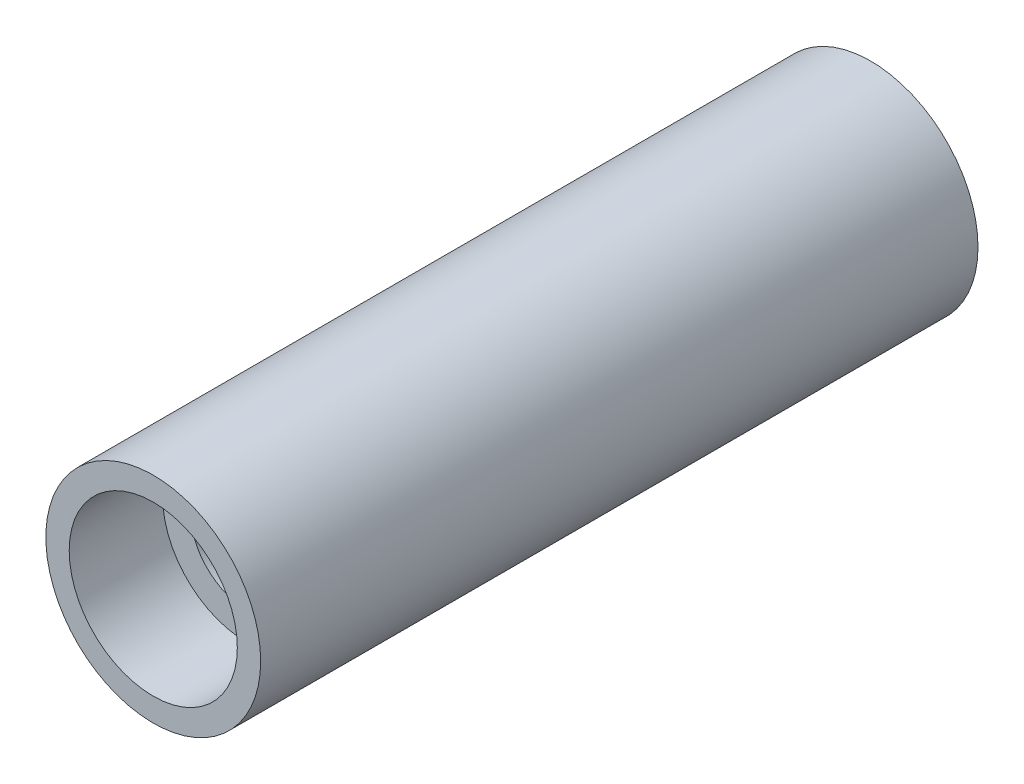
ISO-10303-21;
HEADER;
FILE_DESCRIPTION(('STEP AP214'),'2;1');
FILE_NAME('part.step','',(''),(''),'','','');
FILE_SCHEMA(('AUTOMOTIVE_DESIGN { 1 0 10303 214 1 1 1 1 }'));
ENDSEC;
DATA;
#1=APPLICATION_CONTEXT('core data for automotive mechanical design processes');
#2=APPLICATION_PROTOCOL_DEFINITION('international standard','automotive_design',2000,#1);
#3=PRODUCT_CONTEXT('',#1,'mechanical');
#4=PRODUCT('Part','Part','',(#3));
#5=PRODUCT_RELATED_PRODUCT_CATEGORY('part','',(#4));
#6=PRODUCT_DEFINITION_FORMATION('','',#4);
#7=PRODUCT_DEFINITION_CONTEXT('part definition',#1,'design');
#8=PRODUCT_DEFINITION('design','',#6,#7);
#9=PRODUCT_DEFINITION_SHAPE('','',#8);
#10=(LENGTH_UNIT() NAMED_UNIT(*) SI_UNIT(.MILLI.,.METRE.));
#11=(NAMED_UNIT(*) PLANE_ANGLE_UNIT() SI_UNIT($,.RADIAN.));
#12=(NAMED_UNIT(*) SI_UNIT($,.STERADIAN.) SOLID_ANGLE_UNIT());
#13=UNCERTAINTY_MEASURE_WITH_UNIT(LENGTH_MEASURE(1.E-05),#10,'distance_accuracy_value','');
#14=(GEOMETRIC_REPRESENTATION_CONTEXT(3) GLOBAL_UNCERTAINTY_ASSIGNED_CONTEXT((#13)) GLOBAL_UNIT_ASSIGNED_CONTEXT((#10,
#11,#12)) REPRESENTATION_CONTEXT('',''));
#15=CARTESIAN_POINT('',(0.,0.,0.));
#16=DIRECTION('',(0.,0.,1.));
#17=DIRECTION('',(1.,0.,0.));
#18=AXIS2_PLACEMENT_3D('',#15,#16,#17);
#19=CARTESIAN_POINT('',(0.,0.,19.2));
#20=DIRECTION('',(0.,0.,1.));
#21=DIRECTION('',(1.,0.,0.));
#22=AXIS2_PLACEMENT_3D('',#19,#20,#21);
#23=PLANE('',#22);
#24=CARTESIAN_POINT('',(0.,0.,19.2));
#25=DIRECTION('',(0.,0.,-1.));
#26=DIRECTION('',(-1.,0.,0.));
#27=AXIS2_PLACEMENT_3D('',#24,#25,#26);
#28=CIRCLE('',#27,4.5);
#29=CARTESIAN_POINT('',(-4.5,0.,19.2));
#30=VERTEX_POINT('',#29);
#31=EDGE_CURVE('E62',#30,#30,#28,.T.);
#32=ORIENTED_EDGE('',*,*,#31,.T.);
#33=EDGE_LOOP('',(#32));
#34=FACE_BOUND('',#33,.T.);
#35=CARTESIAN_POINT('',(0.,0.,19.2));
#36=DIRECTION('',(0.,0.,1.));
#37=DIRECTION('',(1.,0.,0.));
#38=AXIS2_PLACEMENT_3D('',#35,#36,#37);
#39=CIRCLE('',#38,5.75);
#40=CARTESIAN_POINT('',(5.75,0.,19.2));
#41=VERTEX_POINT('',#40);
#42=EDGE_CURVE('E10',#41,#41,#39,.T.);
#43=ORIENTED_EDGE('',*,*,#42,.T.);
#44=EDGE_LOOP('',(#43));
#45=FACE_BOUND('',#44,.T.);
#46=ADVANCED_FACE('F32',(#34,#45),#23,.T.);
#47=CARTESIAN_POINT('',(0.,0.,-19.2));
#48=DIRECTION('',(0.,0.,1.));
#49=DIRECTION('',(1.,0.,0.));
#50=AXIS2_PLACEMENT_3D('',#47,#48,#49);
#51=PLANE('',#50);
#52=CARTESIAN_POINT('',(0.,0.,-19.2));
#53=DIRECTION('',(0.,0.,-1.));
#54=DIRECTION('',(-1.,0.,0.));
#55=AXIS2_PLACEMENT_3D('',#52,#53,#54);
#56=CIRCLE('',#55,4.5);
#57=CARTESIAN_POINT('',(-4.5,0.,-19.2));
#58=VERTEX_POINT('',#57);
#59=EDGE_CURVE('E56',#58,#58,#56,.T.);
#60=ORIENTED_EDGE('',*,*,#59,.F.);
#61=EDGE_LOOP('',(#60));
#62=FACE_BOUND('',#61,.T.);
#63=CARTESIAN_POINT('',(0.,0.,-19.2));
#64=DIRECTION('',(0.,0.,1.));
#65=DIRECTION('',(1.,0.,0.));
#66=AXIS2_PLACEMENT_3D('',#63,#64,#65);
#67=CIRCLE('',#66,5.75);
#68=CARTESIAN_POINT('',(5.75,0.,-19.2));
#69=VERTEX_POINT('',#68);
#70=EDGE_CURVE('E40',#69,#69,#67,.T.);
#71=ORIENTED_EDGE('',*,*,#70,.F.);
#72=EDGE_LOOP('',(#71));
#73=FACE_BOUND('',#72,.T.);
#74=ADVANCED_FACE('F81',(#62,#73),#51,.F.);
#75=CARTESIAN_POINT('',(0.,0.,19.2));
#76=DIRECTION('',(0.,0.,-1.));
#77=DIRECTION('',(-1.,0.,0.));
#78=AXIS2_PLACEMENT_3D('',#75,#76,#77);
#79=CYLINDRICAL_SURFACE('',#78,5.75);
#80=ORIENTED_EDGE('',*,*,#42,.F.);
#81=EDGE_LOOP('',(#80));
#82=FACE_BOUND('',#81,.T.);
#83=ORIENTED_EDGE('',*,*,#70,.T.);
#84=EDGE_LOOP('',(#83));
#85=FACE_BOUND('',#84,.T.);
#86=ADVANCED_FACE('F34',(#82,#85),#79,.T.);
#87=CARTESIAN_POINT('',(0.,0.,14.2));
#88=DIRECTION('',(0.,0.,-1.));
#89=DIRECTION('',(-1.,0.,0.));
#90=AXIS2_PLACEMENT_3D('',#87,#88,#89);
#91=PLANE('',#90);
#92=CARTESIAN_POINT('',(0.,0.,14.2));
#93=DIRECTION('',(0.,0.,-1.));
#94=DIRECTION('',(-1.,0.,0.));
#95=AXIS2_PLACEMENT_3D('',#92,#93,#94);
#96=CIRCLE('',#95,3.);
#97=CARTESIAN_POINT('',(-3.,0.,14.2));
#98=VERTEX_POINT('',#97);
#99=EDGE_CURVE('E49',#98,#98,#96,.T.);
#100=ORIENTED_EDGE('',*,*,#99,.T.);
#101=EDGE_LOOP('',(#100));
#102=FACE_BOUND('',#101,.T.);
#103=CARTESIAN_POINT('',(0.,0.,14.2));
#104=DIRECTION('',(0.,0.,-1.));
#105=DIRECTION('',(-1.,0.,0.));
#106=AXIS2_PLACEMENT_3D('',#103,#104,#105);
#107=CIRCLE('',#106,4.5);
#108=CARTESIAN_POINT('',(-4.5,0.,14.2));
#109=VERTEX_POINT('',#108);
#110=EDGE_CURVE('E47',#109,#109,#107,.T.);
#111=ORIENTED_EDGE('',*,*,#110,.F.);
#112=EDGE_LOOP('',(#111));
#113=FACE_BOUND('',#112,.T.);
#114=ADVANCED_FACE('F71',(#102,#113),#91,.F.);
#115=CARTESIAN_POINT('',(0.,0.,-19.2));
#116=DIRECTION('',(0.,0.,-1.));
#117=DIRECTION('',(-1.,0.,0.));
#118=AXIS2_PLACEMENT_3D('',#115,#116,#117);
#119=CYLINDRICAL_SURFACE('',#118,4.5);
#120=ORIENTED_EDGE('',*,*,#31,.F.);
#121=EDGE_LOOP('',(#120));
#122=FACE_BOUND('',#121,.T.);
#123=ORIENTED_EDGE('',*,*,#110,.T.);
#124=EDGE_LOOP('',(#123));
#125=FACE_BOUND('',#124,.T.);
#126=ADVANCED_FACE('F69',(#122,#125),#119,.F.);
#127=CARTESIAN_POINT('',(0.,0.,-14.2));
#128=DIRECTION('',(0.,0.,1.));
#129=DIRECTION('',(1.,0.,0.));
#130=AXIS2_PLACEMENT_3D('',#127,#128,#129);
#131=PLANE('',#130);
#132=CARTESIAN_POINT('',(0.,0.,-14.2));
#133=DIRECTION('',(0.,0.,1.));
#134=DIRECTION('',(1.,0.,0.));
#135=AXIS2_PLACEMENT_3D('',#132,#133,#134);
#136=CIRCLE('',#135,3.);
#137=CARTESIAN_POINT('',(3.,0.,-14.2));
#138=VERTEX_POINT('',#137);
#139=EDGE_CURVE('E36',#138,#138,#136,.T.);
#140=ORIENTED_EDGE('',*,*,#139,.T.);
#141=EDGE_LOOP('',(#140));
#142=FACE_BOUND('',#141,.T.);
#143=CARTESIAN_POINT('',(0.,0.,-14.2));
#144=DIRECTION('',(0.,0.,-1.));
#145=DIRECTION('',(-1.,0.,0.));
#146=AXIS2_PLACEMENT_3D('',#143,#144,#145);
#147=CIRCLE('',#146,4.5);
#148=CARTESIAN_POINT('',(-4.5,0.,-14.2));
#149=VERTEX_POINT('',#148);
#150=EDGE_CURVE('E51',#149,#149,#147,.T.);
#151=ORIENTED_EDGE('',*,*,#150,.T.);
#152=EDGE_LOOP('',(#151));
#153=FACE_BOUND('',#152,.T.);
#154=ADVANCED_FACE('F78',(#142,#153),#131,.F.);
#155=CARTESIAN_POINT('',(0.,0.,-19.2));
#156=DIRECTION('',(0.,0.,-1.));
#157=DIRECTION('',(-1.,0.,0.));
#158=AXIS2_PLACEMENT_3D('',#155,#156,#157);
#159=CYLINDRICAL_SURFACE('',#158,4.5);
#160=ORIENTED_EDGE('',*,*,#150,.F.);
#161=EDGE_LOOP('',(#160));
#162=FACE_BOUND('',#161,.T.);
#163=ORIENTED_EDGE('',*,*,#59,.T.);
#164=EDGE_LOOP('',(#163));
#165=FACE_BOUND('',#164,.T.);
#166=ADVANCED_FACE('F92',(#162,#165),#159,.F.);
#167=CARTESIAN_POINT('',(0.,0.,19.2));
#168=DIRECTION('',(0.,0.,-1.));
#169=DIRECTION('',(-1.,0.,0.));
#170=AXIS2_PLACEMENT_3D('',#167,#168,#169);
#171=CYLINDRICAL_SURFACE('',#170,3.);
#172=ORIENTED_EDGE('',*,*,#139,.F.);
#173=EDGE_LOOP('',(#172));
#174=FACE_BOUND('',#173,.T.);
#175=ORIENTED_EDGE('',*,*,#99,.F.);
#176=EDGE_LOOP('',(#175));
#177=FACE_BOUND('',#176,.T.);
#178=ADVANCED_FACE('F90',(#174,#177),#171,.F.);
#179=CLOSED_SHELL('',(#46,#74,#86,#114,#126,#154,#166,#178));
#180=MANIFOLD_SOLID_BREP('B2',#179);
#181=ADVANCED_BREP_SHAPE_REPRESENTATION('',(#18,#180),#14);
#182=SHAPE_DEFINITION_REPRESENTATION(#9,#181);
ENDSEC;
END-ISO-10303-21;
